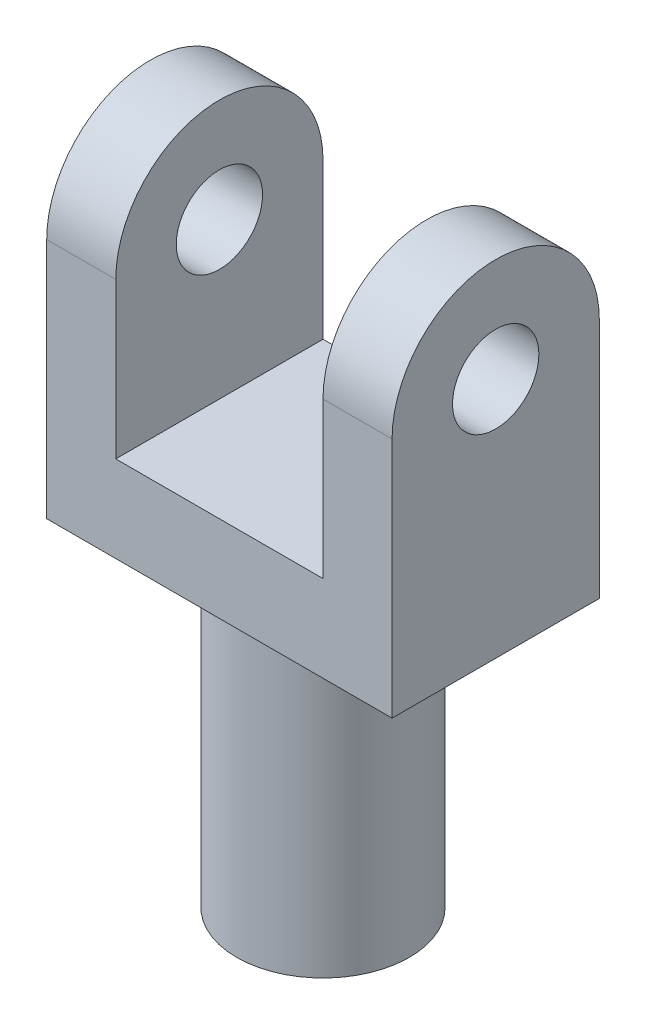
ISO-10303-21;
HEADER;
FILE_DESCRIPTION(('STEP AP214'),'2;1');
FILE_NAME('part.step','',(''),(''),'','','');
FILE_SCHEMA(('AUTOMOTIVE_DESIGN { 1 0 10303 214 1 1 1 1 }'));
ENDSEC;
DATA;
#1=APPLICATION_CONTEXT('core data for automotive mechanical design processes');
#2=APPLICATION_PROTOCOL_DEFINITION('international standard','automotive_design',2000,#1);
#3=PRODUCT_CONTEXT('',#1,'mechanical');
#4=PRODUCT('Part','Part','',(#3));
#5=PRODUCT_RELATED_PRODUCT_CATEGORY('part','',(#4));
#6=PRODUCT_DEFINITION_FORMATION('','',#4);
#7=PRODUCT_DEFINITION_CONTEXT('part definition',#1,'design');
#8=PRODUCT_DEFINITION('design','',#6,#7);
#9=PRODUCT_DEFINITION_SHAPE('','',#8);
#10=(LENGTH_UNIT() NAMED_UNIT(*) SI_UNIT(.MILLI.,.METRE.));
#11=(NAMED_UNIT(*) PLANE_ANGLE_UNIT() SI_UNIT($,.RADIAN.));
#12=(NAMED_UNIT(*) SI_UNIT($,.STERADIAN.) SOLID_ANGLE_UNIT());
#13=UNCERTAINTY_MEASURE_WITH_UNIT(LENGTH_MEASURE(1.E-05),#10,'distance_accuracy_value','');
#14=(GEOMETRIC_REPRESENTATION_CONTEXT(3) GLOBAL_UNCERTAINTY_ASSIGNED_CONTEXT((#13)) GLOBAL_UNIT_ASSIGNED_CONTEXT((#10,
#11,#12)) REPRESENTATION_CONTEXT('',''));
#15=CARTESIAN_POINT('',(0.,0.,0.));
#16=DIRECTION('',(0.,0.,1.));
#17=DIRECTION('',(1.,0.,0.));
#18=AXIS2_PLACEMENT_3D('',#15,#16,#17);
#19=CARTESIAN_POINT('',(0.,35.,0.));
#20=DIRECTION('',(0.,-1.,0.));
#21=DIRECTION('',(0.,0.,-1.));
#22=AXIS2_PLACEMENT_3D('',#19,#20,#21);
#23=CYLINDRICAL_SURFACE('',#22,10.);
#24=CARTESIAN_POINT('',(0.,35.,0.));
#25=DIRECTION('',(0.,1.,0.));
#26=DIRECTION('',(0.,0.,1.));
#27=AXIS2_PLACEMENT_3D('',#24,#25,#26);
#28=CIRCLE('',#27,10.);
#29=CARTESIAN_POINT('',(0.,35.,10.));
#30=VERTEX_POINT('',#29);
#31=EDGE_CURVE('E11',#30,#30,#28,.T.);
#32=ORIENTED_EDGE('',*,*,#31,.F.);
#33=EDGE_LOOP('',(#32));
#34=FACE_BOUND('',#33,.T.);
#35=CARTESIAN_POINT('',(0.,0.,0.));
#36=DIRECTION('',(0.,1.,0.));
#37=DIRECTION('',(0.,0.,1.));
#38=AXIS2_PLACEMENT_3D('',#35,#36,#37);
#39=CIRCLE('',#38,10.);
#40=CARTESIAN_POINT('',(0.,0.,10.));
#41=VERTEX_POINT('',#40);
#42=EDGE_CURVE('E61',#41,#41,#39,.T.);
#43=ORIENTED_EDGE('',*,*,#42,.T.);
#44=EDGE_LOOP('',(#43));
#45=FACE_BOUND('',#44,.T.);
#46=ADVANCED_FACE('F51',(#34,#45),#23,.T.);
#47=CARTESIAN_POINT('',(0.,0.,0.));
#48=DIRECTION('',(0.,1.,0.));
#49=DIRECTION('',(0.,0.,1.));
#50=AXIS2_PLACEMENT_3D('',#47,#48,#49);
#51=PLANE('',#50);
#52=CARTESIAN_POINT('',(0.,0.,0.));
#53=DIRECTION('',(0.,1.,0.));
#54=DIRECTION('',(0.,0.,1.));
#55=AXIS2_PLACEMENT_3D('',#52,#53,#54);
#56=CIRCLE('',#55,3.4);
#57=CARTESIAN_POINT('',(0.,0.,3.4));
#58=VERTEX_POINT('',#57);
#59=EDGE_CURVE('E289',#58,#58,#56,.T.);
#60=ORIENTED_EDGE('',*,*,#59,.T.);
#61=EDGE_LOOP('',(#60));
#62=FACE_BOUND('',#61,.T.);
#63=ORIENTED_EDGE('',*,*,#42,.F.);
#64=EDGE_LOOP('',(#63));
#65=FACE_BOUND('',#64,.T.);
#66=ADVANCED_FACE('F216',(#62,#65),#51,.F.);
#67=CARTESIAN_POINT('',(-20.,45.,12.));
#68=DIRECTION('',(1.,0.,0.));
#69=DIRECTION('',(0.,0.,-1.));
#70=AXIS2_PLACEMENT_3D('',#67,#68,#69);
#71=PLANE('',#70);
#72=CARTESIAN_POINT('',(-20.,63.,0.));
#73=DIRECTION('',(1.,0.,0.));
#74=DIRECTION('',(0.,0.,-1.));
#75=AXIS2_PLACEMENT_3D('',#72,#73,#74);
#76=CIRCLE('',#75,5.);
#77=CARTESIAN_POINT('',(-20.,63.,-5.));
#78=VERTEX_POINT('',#77);
#79=EDGE_CURVE('E154',#78,#78,#76,.T.);
#80=ORIENTED_EDGE('',*,*,#79,.T.);
#81=EDGE_LOOP('',(#80));
#82=FACE_BOUND('',#81,.T.);
#83=DIRECTION('',(0.,0.,1.));
#84=VECTOR('',#83,1.);
#85=CARTESIAN_POINT('',(-20.,35.,12.));
#86=LINE('',#85,#84);
#87=CARTESIAN_POINT('',(-20.,35.,-12.));
#88=VERTEX_POINT('',#87);
#89=CARTESIAN_POINT('',(-20.,35.,12.));
#90=VERTEX_POINT('',#89);
#91=EDGE_CURVE('E181',#88,#90,#86,.T.);
#92=ORIENTED_EDGE('',*,*,#91,.T.);
#93=DIRECTION('',(0.,-1.,0.));
#94=VECTOR('',#93,1.);
#95=CARTESIAN_POINT('',(-20.,45.,12.));
#96=LINE('',#95,#94);
#97=CARTESIAN_POINT('',(-20.,63.,12.));
#98=VERTEX_POINT('',#97);
#99=EDGE_CURVE('E208',#98,#90,#96,.T.);
#100=ORIENTED_EDGE('',*,*,#99,.F.);
#101=CARTESIAN_POINT('',(-20.,63.,0.));
#102=DIRECTION('',(1.,0.,0.));
#103=DIRECTION('',(0.,0.,-1.));
#104=AXIS2_PLACEMENT_3D('',#101,#102,#103);
#105=CIRCLE('',#104,12.);
#106=CARTESIAN_POINT('',(-20.,63.,-12.));
#107=VERTEX_POINT('',#106);
#108=EDGE_CURVE('E151',#107,#98,#105,.T.);
#109=ORIENTED_EDGE('',*,*,#108,.F.);
#110=DIRECTION('',(0.,-1.,0.));
#111=VECTOR('',#110,1.);
#112=CARTESIAN_POINT('',(-20.,45.,-12.));
#113=LINE('',#112,#111);
#114=EDGE_CURVE('E131',#107,#88,#113,.T.);
#115=ORIENTED_EDGE('',*,*,#114,.T.);
#116=EDGE_LOOP('',(#92,#100,#109,#115));
#117=FACE_BOUND('',#116,.T.);
#118=ADVANCED_FACE('F218',(#82,#117),#71,.F.);
#119=CARTESIAN_POINT('',(20.,45.,12.));
#120=DIRECTION('',(0.,0.,-1.));
#121=DIRECTION('',(-1.,0.,0.));
#122=AXIS2_PLACEMENT_3D('',#119,#120,#121);
#123=PLANE('',#122);
#124=DIRECTION('',(1.,0.,0.));
#125=VECTOR('',#124,1.);
#126=CARTESIAN_POINT('',(20.,35.,12.));
#127=LINE('',#126,#125);
#128=CARTESIAN_POINT('',(20.,35.,12.));
#129=VERTEX_POINT('',#128);
#130=EDGE_CURVE('E191',#90,#129,#127,.T.);
#131=ORIENTED_EDGE('',*,*,#130,.T.);
#132=DIRECTION('',(0.,-1.,0.));
#133=VECTOR('',#132,1.);
#134=CARTESIAN_POINT('',(20.,45.,12.));
#135=LINE('',#134,#133);
#136=CARTESIAN_POINT('',(20.,63.,12.));
#137=VERTEX_POINT('',#136);
#138=EDGE_CURVE('E204',#137,#129,#135,.T.);
#139=ORIENTED_EDGE('',*,*,#138,.F.);
#140=DIRECTION('',(-1.,0.,0.));
#141=VECTOR('',#140,1.);
#142=CARTESIAN_POINT('',(20.,63.,12.));
#143=LINE('',#142,#141);
#144=CARTESIAN_POINT('',(12.,63.,12.));
#145=VERTEX_POINT('',#144);
#146=EDGE_CURVE('E161',#137,#145,#143,.T.);
#147=ORIENTED_EDGE('',*,*,#146,.T.);
#148=DIRECTION('',(0.,-1.,0.));
#149=VECTOR('',#148,1.);
#150=CARTESIAN_POINT('',(12.,63.,12.));
#151=LINE('',#150,#149);
#152=CARTESIAN_POINT('',(12.,45.,12.));
#153=VERTEX_POINT('',#152);
#154=EDGE_CURVE('E162',#145,#153,#151,.T.);
#155=ORIENTED_EDGE('',*,*,#154,.T.);
#156=DIRECTION('',(1.,0.,0.));
#157=VECTOR('',#156,1.);
#158=CARTESIAN_POINT('',(20.,45.,12.));
#159=LINE('',#158,#157);
#160=CARTESIAN_POINT('',(-12.,45.,12.));
#161=VERTEX_POINT('',#160);
#162=EDGE_CURVE('E182',#161,#153,#159,.T.);
#163=ORIENTED_EDGE('',*,*,#162,.F.);
#164=DIRECTION('',(0.,-1.,0.));
#165=VECTOR('',#164,1.);
#166=CARTESIAN_POINT('',(-12.,63.,12.));
#167=LINE('',#166,#165);
#168=CARTESIAN_POINT('',(-12.,63.,12.));
#169=VERTEX_POINT('',#168);
#170=EDGE_CURVE('E143',#169,#161,#167,.T.);
#171=ORIENTED_EDGE('',*,*,#170,.F.);
#172=DIRECTION('',(-1.,0.,0.));
#173=VECTOR('',#172,1.);
#174=CARTESIAN_POINT('',(-12.,63.,12.));
#175=LINE('',#174,#173);
#176=EDGE_CURVE('E137',#169,#98,#175,.T.);
#177=ORIENTED_EDGE('',*,*,#176,.T.);
#178=ORIENTED_EDGE('',*,*,#99,.T.);
#179=EDGE_LOOP('',(#131,#139,#147,#155,#163,#171,#177,#178));
#180=FACE_BOUND('',#179,.T.);
#181=ADVANCED_FACE('F223',(#180),#123,.F.);
#182=CARTESIAN_POINT('',(20.,45.,-12.));
#183=DIRECTION('',(-1.,0.,0.));
#184=DIRECTION('',(0.,0.,1.));
#185=AXIS2_PLACEMENT_3D('',#182,#183,#184);
#186=PLANE('',#185);
#187=CARTESIAN_POINT('',(20.,63.,0.));
#188=DIRECTION('',(-1.,0.,0.));
#189=DIRECTION('',(0.,0.,1.));
#190=AXIS2_PLACEMENT_3D('',#187,#188,#189);
#191=CIRCLE('',#190,5.);
#192=CARTESIAN_POINT('',(20.,63.,5.));
#193=VERTEX_POINT('',#192);
#194=EDGE_CURVE('E300',#193,#193,#191,.T.);
#195=ORIENTED_EDGE('',*,*,#194,.T.);
#196=EDGE_LOOP('',(#195));
#197=FACE_BOUND('',#196,.T.);
#198=DIRECTION('',(0.,0.,-1.));
#199=VECTOR('',#198,1.);
#200=CARTESIAN_POINT('',(20.,35.,-12.));
#201=LINE('',#200,#199);
#202=CARTESIAN_POINT('',(20.,35.,-12.));
#203=VERTEX_POINT('',#202);
#204=EDGE_CURVE('E193',#129,#203,#201,.T.);
#205=ORIENTED_EDGE('',*,*,#204,.T.);
#206=DIRECTION('',(0.,-1.,0.));
#207=VECTOR('',#206,1.);
#208=CARTESIAN_POINT('',(20.,45.,-12.));
#209=LINE('',#208,#207);
#210=CARTESIAN_POINT('',(20.,63.,-12.));
#211=VERTEX_POINT('',#210);
#212=EDGE_CURVE('E200',#211,#203,#209,.T.);
#213=ORIENTED_EDGE('',*,*,#212,.F.);
#214=CARTESIAN_POINT('',(20.,63.,0.));
#215=DIRECTION('',(1.,0.,0.));
#216=DIRECTION('',(0.,0.,-1.));
#217=AXIS2_PLACEMENT_3D('',#214,#215,#216);
#218=CIRCLE('',#217,12.);
#219=EDGE_CURVE('E157',#211,#137,#218,.T.);
#220=ORIENTED_EDGE('',*,*,#219,.T.);
#221=ORIENTED_EDGE('',*,*,#138,.T.);
#222=EDGE_LOOP('',(#205,#213,#220,#221));
#223=FACE_BOUND('',#222,.T.);
#224=ADVANCED_FACE('F235',(#197,#223),#186,.F.);
#225=CARTESIAN_POINT('',(-20.,45.,-12.));
#226=DIRECTION('',(0.,0.,1.));
#227=DIRECTION('',(1.,0.,0.));
#228=AXIS2_PLACEMENT_3D('',#225,#226,#227);
#229=PLANE('',#228);
#230=DIRECTION('',(-1.,0.,0.));
#231=VECTOR('',#230,1.);
#232=CARTESIAN_POINT('',(-20.,35.,-12.));
#233=LINE('',#232,#231);
#234=EDGE_CURVE('E185',#203,#88,#233,.T.);
#235=ORIENTED_EDGE('',*,*,#234,.T.);
#236=ORIENTED_EDGE('',*,*,#114,.F.);
#237=DIRECTION('',(-1.,0.,0.));
#238=VECTOR('',#237,1.);
#239=CARTESIAN_POINT('',(-12.,63.,-12.));
#240=LINE('',#239,#238);
#241=CARTESIAN_POINT('',(-12.,63.,-12.));
#242=VERTEX_POINT('',#241);
#243=EDGE_CURVE('E128',#242,#107,#240,.T.);
#244=ORIENTED_EDGE('',*,*,#243,.F.);
#245=DIRECTION('',(0.,1.,0.));
#246=VECTOR('',#245,1.);
#247=CARTESIAN_POINT('',(-12.,45.,-12.));
#248=LINE('',#247,#246);
#249=CARTESIAN_POINT('',(-12.,45.,-12.));
#250=VERTEX_POINT('',#249);
#251=EDGE_CURVE('E117',#250,#242,#248,.T.);
#252=ORIENTED_EDGE('',*,*,#251,.F.);
#253=DIRECTION('',(-1.,0.,0.));
#254=VECTOR('',#253,1.);
#255=CARTESIAN_POINT('',(-20.,45.,-12.));
#256=LINE('',#255,#254);
#257=CARTESIAN_POINT('',(12.,45.,-12.));
#258=VERTEX_POINT('',#257);
#259=EDGE_CURVE('E69',#258,#250,#256,.T.);
#260=ORIENTED_EDGE('',*,*,#259,.F.);
#261=DIRECTION('',(0.,1.,0.));
#262=VECTOR('',#261,1.);
#263=CARTESIAN_POINT('',(12.,45.,-12.));
#264=LINE('',#263,#262);
#265=CARTESIAN_POINT('',(12.,63.,-12.));
#266=VERTEX_POINT('',#265);
#267=EDGE_CURVE('E165',#258,#266,#264,.T.);
#268=ORIENTED_EDGE('',*,*,#267,.T.);
#269=DIRECTION('',(-1.,0.,0.));
#270=VECTOR('',#269,1.);
#271=CARTESIAN_POINT('',(20.,63.,-12.));
#272=LINE('',#271,#270);
#273=EDGE_CURVE('E177',#211,#266,#272,.T.);
#274=ORIENTED_EDGE('',*,*,#273,.F.);
#275=ORIENTED_EDGE('',*,*,#212,.T.);
#276=EDGE_LOOP('',(#235,#236,#244,#252,#260,#268,#274,#275));
#277=FACE_BOUND('',#276,.T.);
#278=ADVANCED_FACE('F129',(#277),#229,.F.);
#279=CARTESIAN_POINT('',(0.,45.,0.));
#280=DIRECTION('',(0.,-1.,0.));
#281=DIRECTION('',(0.,0.,-1.));
#282=AXIS2_PLACEMENT_3D('',#279,#280,#281);
#283=PLANE('',#282);
#284=ORIENTED_EDGE('',*,*,#259,.T.);
#285=DIRECTION('',(0.,0.,-1.));
#286=VECTOR('',#285,1.);
#287=CARTESIAN_POINT('',(-12.,45.,12.));
#288=LINE('',#287,#286);
#289=EDGE_CURVE('E74',#161,#250,#288,.T.);
#290=ORIENTED_EDGE('',*,*,#289,.F.);
#291=ORIENTED_EDGE('',*,*,#162,.T.);
#292=DIRECTION('',(0.,0.,-1.));
#293=VECTOR('',#292,1.);
#294=CARTESIAN_POINT('',(12.,45.,12.));
#295=LINE('',#294,#293);
#296=EDGE_CURVE('E136',#153,#258,#295,.T.);
#297=ORIENTED_EDGE('',*,*,#296,.T.);
#298=EDGE_LOOP('',(#284,#290,#291,#297));
#299=FACE_BOUND('',#298,.T.);
#300=ADVANCED_FACE('F244',(#299),#283,.F.);
#301=CARTESIAN_POINT('',(0.,35.,0.));
#302=DIRECTION('',(0.,-1.,0.));
#303=DIRECTION('',(0.,0.,-1.));
#304=AXIS2_PLACEMENT_3D('',#301,#302,#303);
#305=PLANE('',#304);
#306=ORIENTED_EDGE('',*,*,#31,.T.);
#307=EDGE_LOOP('',(#306));
#308=FACE_BOUND('',#307,.T.);
#309=ORIENTED_EDGE('',*,*,#91,.F.);
#310=ORIENTED_EDGE('',*,*,#234,.F.);
#311=ORIENTED_EDGE('',*,*,#204,.F.);
#312=ORIENTED_EDGE('',*,*,#130,.F.);
#313=EDGE_LOOP('',(#309,#310,#311,#312));
#314=FACE_BOUND('',#313,.T.);
#315=ADVANCED_FACE('F246',(#308,#314),#305,.T.);
#316=CARTESIAN_POINT('',(20.,63.,0.));
#317=DIRECTION('',(-1.,0.,0.));
#318=DIRECTION('',(0.,0.,1.));
#319=AXIS2_PLACEMENT_3D('',#316,#317,#318);
#320=CYLINDRICAL_SURFACE('',#319,12.);
#321=CARTESIAN_POINT('',(12.,63.,0.));
#322=DIRECTION('',(1.,0.,0.));
#323=DIRECTION('',(0.,0.,-1.));
#324=AXIS2_PLACEMENT_3D('',#321,#322,#323);
#325=CIRCLE('',#324,12.);
#326=EDGE_CURVE('E168',#266,#145,#325,.T.);
#327=ORIENTED_EDGE('',*,*,#326,.T.);
#328=ORIENTED_EDGE('',*,*,#146,.F.);
#329=ORIENTED_EDGE('',*,*,#219,.F.);
#330=ORIENTED_EDGE('',*,*,#273,.T.);
#331=EDGE_LOOP('',(#327,#328,#329,#330));
#332=FACE_BOUND('',#331,.T.);
#333=ADVANCED_FACE('F250',(#332),#320,.T.);
#334=CARTESIAN_POINT('',(12.,63.,0.));
#335=DIRECTION('',(1.,0.,0.));
#336=DIRECTION('',(0.,0.,-1.));
#337=AXIS2_PLACEMENT_3D('',#334,#335,#336);
#338=PLANE('',#337);
#339=CARTESIAN_POINT('',(12.,63.,0.));
#340=DIRECTION('',(1.,0.,0.));
#341=DIRECTION('',(0.,0.,-1.));
#342=AXIS2_PLACEMENT_3D('',#339,#340,#341);
#343=CIRCLE('',#342,5.);
#344=CARTESIAN_POINT('',(12.,63.,-5.));
#345=VERTEX_POINT('',#344);
#346=EDGE_CURVE('E293',#345,#345,#343,.T.);
#347=ORIENTED_EDGE('',*,*,#346,.T.);
#348=EDGE_LOOP('',(#347));
#349=FACE_BOUND('',#348,.T.);
#350=ORIENTED_EDGE('',*,*,#296,.F.);
#351=ORIENTED_EDGE('',*,*,#154,.F.);
#352=ORIENTED_EDGE('',*,*,#326,.F.);
#353=ORIENTED_EDGE('',*,*,#267,.F.);
#354=EDGE_LOOP('',(#350,#351,#352,#353));
#355=FACE_BOUND('',#354,.T.);
#356=ADVANCED_FACE('F257',(#349,#355),#338,.F.);
#357=CARTESIAN_POINT('',(-12.,63.,0.));
#358=DIRECTION('',(-1.,0.,0.));
#359=DIRECTION('',(0.,0.,1.));
#360=AXIS2_PLACEMENT_3D('',#357,#358,#359);
#361=CYLINDRICAL_SURFACE('',#360,12.);
#362=ORIENTED_EDGE('',*,*,#108,.T.);
#363=ORIENTED_EDGE('',*,*,#176,.F.);
#364=CARTESIAN_POINT('',(-12.,63.,0.));
#365=DIRECTION('',(1.,0.,0.));
#366=DIRECTION('',(0.,0.,-1.));
#367=AXIS2_PLACEMENT_3D('',#364,#365,#366);
#368=CIRCLE('',#367,12.);
#369=EDGE_CURVE('E122',#242,#169,#368,.T.);
#370=ORIENTED_EDGE('',*,*,#369,.F.);
#371=ORIENTED_EDGE('',*,*,#243,.T.);
#372=EDGE_LOOP('',(#362,#363,#370,#371));
#373=FACE_BOUND('',#372,.T.);
#374=ADVANCED_FACE('F139',(#373),#361,.T.);
#375=CARTESIAN_POINT('',(-12.,63.,0.));
#376=DIRECTION('',(1.,0.,0.));
#377=DIRECTION('',(0.,0.,-1.));
#378=AXIS2_PLACEMENT_3D('',#375,#376,#377);
#379=PLANE('',#378);
#380=CARTESIAN_POINT('',(-12.,63.,0.));
#381=DIRECTION('',(1.,0.,0.));
#382=DIRECTION('',(0.,0.,-1.));
#383=AXIS2_PLACEMENT_3D('',#380,#381,#382);
#384=CIRCLE('',#383,5.);
#385=CARTESIAN_POINT('',(-12.,63.,-5.));
#386=VERTEX_POINT('',#385);
#387=EDGE_CURVE('E55',#386,#386,#384,.T.);
#388=ORIENTED_EDGE('',*,*,#387,.F.);
#389=EDGE_LOOP('',(#388));
#390=FACE_BOUND('',#389,.T.);
#391=ORIENTED_EDGE('',*,*,#289,.T.);
#392=ORIENTED_EDGE('',*,*,#251,.T.);
#393=ORIENTED_EDGE('',*,*,#369,.T.);
#394=ORIENTED_EDGE('',*,*,#170,.T.);
#395=EDGE_LOOP('',(#391,#392,#393,#394));
#396=FACE_BOUND('',#395,.T.);
#397=ADVANCED_FACE('F119',(#390,#396),#379,.T.);
#398=CARTESIAN_POINT('',(-96.,63.,0.));
#399=DIRECTION('',(1.,0.,0.));
#400=DIRECTION('',(0.,0.,-1.));
#401=AXIS2_PLACEMENT_3D('',#398,#399,#400);
#402=CYLINDRICAL_SURFACE('',#401,5.);
#403=ORIENTED_EDGE('',*,*,#387,.T.);
#404=EDGE_LOOP('',(#403));
#405=FACE_BOUND('',#404,.T.);
#406=ORIENTED_EDGE('',*,*,#79,.F.);
#407=EDGE_LOOP('',(#406));
#408=FACE_BOUND('',#407,.T.);
#409=ADVANCED_FACE('F269',(#405,#408),#402,.F.);
#410=ORIENTED_EDGE('',*,*,#346,.F.);
#411=EDGE_LOOP('',(#410));
#412=FACE_BOUND('',#411,.T.);
#413=ORIENTED_EDGE('',*,*,#194,.F.);
#414=EDGE_LOOP('',(#413));
#415=FACE_BOUND('',#414,.T.);
#416=ADVANCED_FACE('F274',(#412,#415),#402,.F.);
#417=CARTESIAN_POINT('',(0.,20.,0.));
#418=DIRECTION('',(0.,-1.,0.));
#419=DIRECTION('',(0.,0.,-1.));
#420=AXIS2_PLACEMENT_3D('',#417,#418,#419);
#421=CYLINDRICAL_SURFACE('',#420,3.4);
#422=CARTESIAN_POINT('',(0.,20.,0.));
#423=DIRECTION('',(0.,1.,0.));
#424=DIRECTION('',(0.,0.,1.));
#425=AXIS2_PLACEMENT_3D('',#422,#423,#424);
#426=CIRCLE('',#425,3.4);
#427=CARTESIAN_POINT('',(0.,20.,3.4));
#428=VERTEX_POINT('',#427);
#429=EDGE_CURVE('E287',#428,#428,#426,.T.);
#430=ORIENTED_EDGE('',*,*,#429,.T.);
#431=EDGE_LOOP('',(#430));
#432=FACE_BOUND('',#431,.T.);
#433=ORIENTED_EDGE('',*,*,#59,.F.);
#434=EDGE_LOOP('',(#433));
#435=FACE_BOUND('',#434,.T.);
#436=ADVANCED_FACE('F276',(#432,#435),#421,.F.);
#437=CARTESIAN_POINT('',(0.,20.,0.));
#438=DIRECTION('',(0.,1.,0.));
#439=DIRECTION('',(0.,0.,1.));
#440=AXIS2_PLACEMENT_3D('',#437,#438,#439);
#441=PLANE('',#440);
#442=ORIENTED_EDGE('',*,*,#429,.F.);
#443=EDGE_LOOP('',(#442));
#444=FACE_BOUND('',#443,.T.);
#445=ADVANCED_FACE('F280',(#444),#441,.F.);
#446=CLOSED_SHELL('',(#46,#66,#118,#181,#224,#278,#300,#315,#333,#356,#374,#397,#409,#416,#436,#445));
#447=MANIFOLD_SOLID_BREP('B2',#446);
#448=ADVANCED_BREP_SHAPE_REPRESENTATION('',(#18,#447),#14);
#449=SHAPE_DEFINITION_REPRESENTATION(#9,#448);
ENDSEC;
END-ISO-10303-21;
